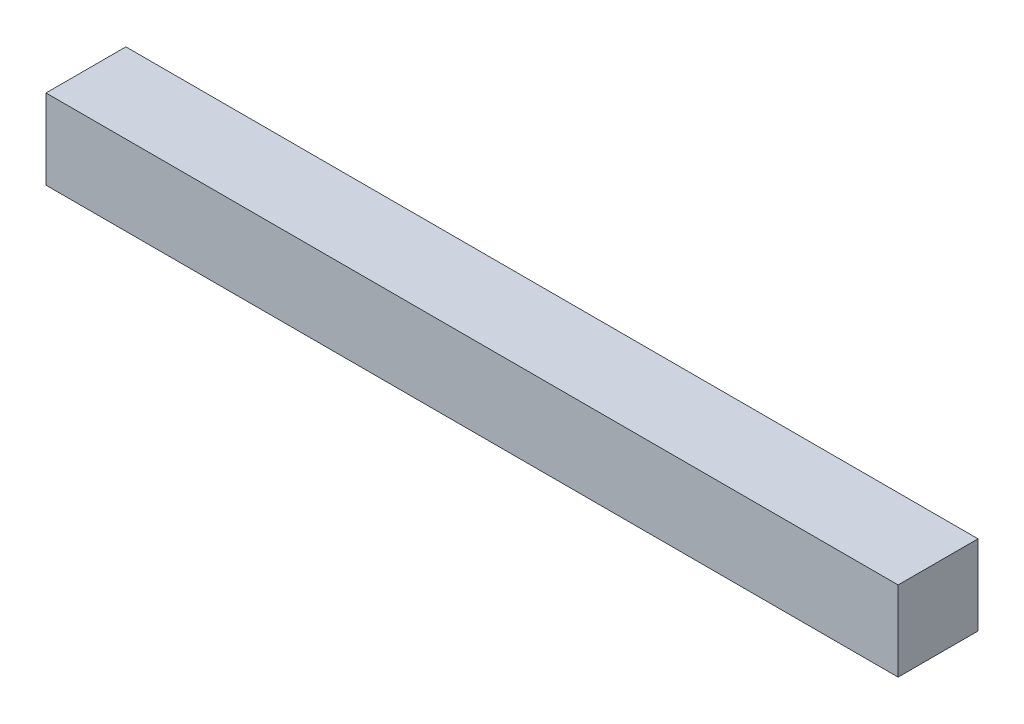
ISO-10303-21;
HEADER;
FILE_DESCRIPTION(('STEP AP214'),'2;1');
FILE_NAME('part.step','',(''),(''),'','','');
FILE_SCHEMA(('AUTOMOTIVE_DESIGN { 1 0 10303 214 1 1 1 1 }'));
ENDSEC;
DATA;
#1=APPLICATION_CONTEXT('core data for automotive mechanical design processes');
#2=APPLICATION_PROTOCOL_DEFINITION('international standard','automotive_design',2000,#1);
#3=PRODUCT_CONTEXT('',#1,'mechanical');
#4=PRODUCT('Part','Part','',(#3));
#5=PRODUCT_RELATED_PRODUCT_CATEGORY('part','',(#4));
#6=PRODUCT_DEFINITION_FORMATION('','',#4);
#7=PRODUCT_DEFINITION_CONTEXT('part definition',#1,'design');
#8=PRODUCT_DEFINITION('design','',#6,#7);
#9=PRODUCT_DEFINITION_SHAPE('','',#8);
#10=(LENGTH_UNIT() NAMED_UNIT(*) SI_UNIT(.MILLI.,.METRE.));
#11=(NAMED_UNIT(*) PLANE_ANGLE_UNIT() SI_UNIT($,.RADIAN.));
#12=(NAMED_UNIT(*) SI_UNIT($,.STERADIAN.) SOLID_ANGLE_UNIT());
#13=UNCERTAINTY_MEASURE_WITH_UNIT(LENGTH_MEASURE(1.E-05),#10,'distance_accuracy_value','');
#14=(GEOMETRIC_REPRESENTATION_CONTEXT(3) GLOBAL_UNCERTAINTY_ASSIGNED_CONTEXT((#13)) GLOBAL_UNIT_ASSIGNED_CONTEXT((#10,
#11,#12)) REPRESENTATION_CONTEXT('',''));
#15=CARTESIAN_POINT('',(0.,0.,0.));
#16=DIRECTION('',(0.,0.,1.));
#17=DIRECTION('',(1.,0.,0.));
#18=AXIS2_PLACEMENT_3D('',#15,#16,#17);
#19=CARTESIAN_POINT('',(406.4,0.,0.));
#20=DIRECTION('',(0.,0.,-1.));
#21=DIRECTION('',(0.,1.,0.));
#22=AXIS2_PLACEMENT_3D('',#19,#20,#21);
#23=PLANE('',#22);
#24=DIRECTION('',(0.,-1.,0.));
#25=VECTOR('',#24,1.);
#26=CARTESIAN_POINT('',(0.,0.,0.));
#27=LINE('',#26,#25);
#28=CARTESIAN_POINT('',(0.,0.,0.));
#29=VERTEX_POINT('',#28);
#30=CARTESIAN_POINT('',(0.,-38.1,0.));
#31=VERTEX_POINT('',#30);
#32=EDGE_CURVE('E111',#29,#31,#27,.T.);
#33=ORIENTED_EDGE('',*,*,#32,.T.);
#34=DIRECTION('',(-1.,0.,0.));
#35=VECTOR('',#34,1.);
#36=CARTESIAN_POINT('',(406.4,-38.1,0.));
#37=LINE('',#36,#35);
#38=CARTESIAN_POINT('',(406.4,-38.1,0.));
#39=VERTEX_POINT('',#38);
#40=EDGE_CURVE('E11',#39,#31,#37,.T.);
#41=ORIENTED_EDGE('',*,*,#40,.F.);
#42=DIRECTION('',(0.,-1.,0.));
#43=VECTOR('',#42,1.);
#44=CARTESIAN_POINT('',(406.4,0.,0.));
#45=LINE('',#44,#43);
#46=CARTESIAN_POINT('',(406.4,0.,0.));
#47=VERTEX_POINT('',#46);
#48=EDGE_CURVE('E95',#47,#39,#45,.T.);
#49=ORIENTED_EDGE('',*,*,#48,.F.);
#50=DIRECTION('',(-1.,0.,0.));
#51=VECTOR('',#50,1.);
#52=CARTESIAN_POINT('',(406.4,0.,0.));
#53=LINE('',#52,#51);
#54=EDGE_CURVE('E107',#47,#29,#53,.T.);
#55=ORIENTED_EDGE('',*,*,#54,.T.);
#56=EDGE_LOOP('',(#33,#41,#49,#55));
#57=FACE_BOUND('',#56,.T.);
#58=ADVANCED_FACE('F43',(#57),#23,.F.);
#59=CARTESIAN_POINT('',(406.4,-38.1,0.));
#60=DIRECTION('',(0.,1.,0.));
#61=DIRECTION('',(0.,0.,1.));
#62=AXIS2_PLACEMENT_3D('',#59,#60,#61);
#63=PLANE('',#62);
#64=DIRECTION('',(0.,0.,-1.));
#65=VECTOR('',#64,1.);
#66=CARTESIAN_POINT('',(0.,-38.1,0.));
#67=LINE('',#66,#65);
#68=CARTESIAN_POINT('',(0.,-38.1,-38.1));
#69=VERTEX_POINT('',#68);
#70=EDGE_CURVE('E100',#31,#69,#67,.T.);
#71=ORIENTED_EDGE('',*,*,#70,.T.);
#72=DIRECTION('',(-1.,0.,0.));
#73=VECTOR('',#72,1.);
#74=CARTESIAN_POINT('',(406.4,-38.1,-38.1));
#75=LINE('',#74,#73);
#76=CARTESIAN_POINT('',(406.4,-38.1,-38.1));
#77=VERTEX_POINT('',#76);
#78=EDGE_CURVE('E52',#77,#69,#75,.T.);
#79=ORIENTED_EDGE('',*,*,#78,.F.);
#80=DIRECTION('',(0.,0.,-1.));
#81=VECTOR('',#80,1.);
#82=CARTESIAN_POINT('',(406.4,-38.1,0.));
#83=LINE('',#82,#81);
#84=EDGE_CURVE('E90',#39,#77,#83,.T.);
#85=ORIENTED_EDGE('',*,*,#84,.F.);
#86=ORIENTED_EDGE('',*,*,#40,.T.);
#87=EDGE_LOOP('',(#71,#79,#85,#86));
#88=FACE_BOUND('',#87,.T.);
#89=ADVANCED_FACE('F99',(#88),#63,.F.);
#90=CARTESIAN_POINT('',(406.4,0.,-38.1));
#91=DIRECTION('',(0.,0.,1.));
#92=DIRECTION('',(1.,0.,0.));
#93=AXIS2_PLACEMENT_3D('',#90,#91,#92);
#94=PLANE('',#93);
#95=DIRECTION('',(0.,1.,0.));
#96=VECTOR('',#95,1.);
#97=CARTESIAN_POINT('',(0.,0.,-38.1));
#98=LINE('',#97,#96);
#99=CARTESIAN_POINT('',(0.,0.,-38.1));
#100=VERTEX_POINT('',#99);
#101=EDGE_CURVE('E77',#69,#100,#98,.T.);
#102=ORIENTED_EDGE('',*,*,#101,.T.);
#103=DIRECTION('',(-1.,0.,0.));
#104=VECTOR('',#103,1.);
#105=CARTESIAN_POINT('',(406.4,0.,-38.1));
#106=LINE('',#105,#104);
#107=CARTESIAN_POINT('',(406.4,0.,-38.1));
#108=VERTEX_POINT('',#107);
#109=EDGE_CURVE('E102',#108,#100,#106,.T.);
#110=ORIENTED_EDGE('',*,*,#109,.F.);
#111=DIRECTION('',(0.,1.,0.));
#112=VECTOR('',#111,1.);
#113=CARTESIAN_POINT('',(406.4,0.,-38.1));
#114=LINE('',#113,#112);
#115=EDGE_CURVE('E93',#77,#108,#114,.T.);
#116=ORIENTED_EDGE('',*,*,#115,.F.);
#117=ORIENTED_EDGE('',*,*,#78,.T.);
#118=EDGE_LOOP('',(#102,#110,#116,#117));
#119=FACE_BOUND('',#118,.T.);
#120=ADVANCED_FACE('F103',(#119),#94,.F.);
#121=CARTESIAN_POINT('',(406.4,0.,0.));
#122=DIRECTION('',(0.,-1.,0.));
#123=DIRECTION('',(0.,0.,-1.));
#124=AXIS2_PLACEMENT_3D('',#121,#122,#123);
#125=PLANE('',#124);
#126=DIRECTION('',(0.,0.,1.));
#127=VECTOR('',#126,1.);
#128=CARTESIAN_POINT('',(0.,0.,0.));
#129=LINE('',#128,#127);
#130=EDGE_CURVE('E83',#100,#29,#129,.T.);
#131=ORIENTED_EDGE('',*,*,#130,.T.);
#132=ORIENTED_EDGE('',*,*,#54,.F.);
#133=DIRECTION('',(0.,0.,1.));
#134=VECTOR('',#133,1.);
#135=CARTESIAN_POINT('',(406.4,0.,0.));
#136=LINE('',#135,#134);
#137=EDGE_CURVE('E60',#108,#47,#136,.T.);
#138=ORIENTED_EDGE('',*,*,#137,.F.);
#139=ORIENTED_EDGE('',*,*,#109,.T.);
#140=EDGE_LOOP('',(#131,#132,#138,#139));
#141=FACE_BOUND('',#140,.T.);
#142=ADVANCED_FACE('F124',(#141),#125,.F.);
#143=CARTESIAN_POINT('',(406.4,0.,0.));
#144=DIRECTION('',(1.,0.,0.));
#145=DIRECTION('',(0.,0.,-1.));
#146=AXIS2_PLACEMENT_3D('',#143,#144,#145);
#147=PLANE('',#146);
#148=ORIENTED_EDGE('',*,*,#48,.T.);
#149=ORIENTED_EDGE('',*,*,#84,.T.);
#150=ORIENTED_EDGE('',*,*,#115,.T.);
#151=ORIENTED_EDGE('',*,*,#137,.T.);
#152=EDGE_LOOP('',(#148,#149,#150,#151));
#153=FACE_BOUND('',#152,.T.);
#154=ADVANCED_FACE('F91',(#153),#147,.T.);
#155=CARTESIAN_POINT('',(0.,0.,0.));
#156=DIRECTION('',(1.,0.,0.));
#157=DIRECTION('',(0.,0.,-1.));
#158=AXIS2_PLACEMENT_3D('',#155,#156,#157);
#159=PLANE('',#158);
#160=ORIENTED_EDGE('',*,*,#32,.F.);
#161=ORIENTED_EDGE('',*,*,#130,.F.);
#162=ORIENTED_EDGE('',*,*,#101,.F.);
#163=ORIENTED_EDGE('',*,*,#70,.F.);
#164=EDGE_LOOP('',(#160,#161,#162,#163));
#165=FACE_BOUND('',#164,.T.);
#166=ADVANCED_FACE('F127',(#165),#159,.F.);
#167=CLOSED_SHELL('',(#58,#89,#120,#142,#154,#166));
#168=MANIFOLD_SOLID_BREP('B2',#167);
#169=ADVANCED_BREP_SHAPE_REPRESENTATION('',(#18,#168),#14);
#170=SHAPE_DEFINITION_REPRESENTATION(#9,#169);
ENDSEC;
END-ISO-10303-21;
